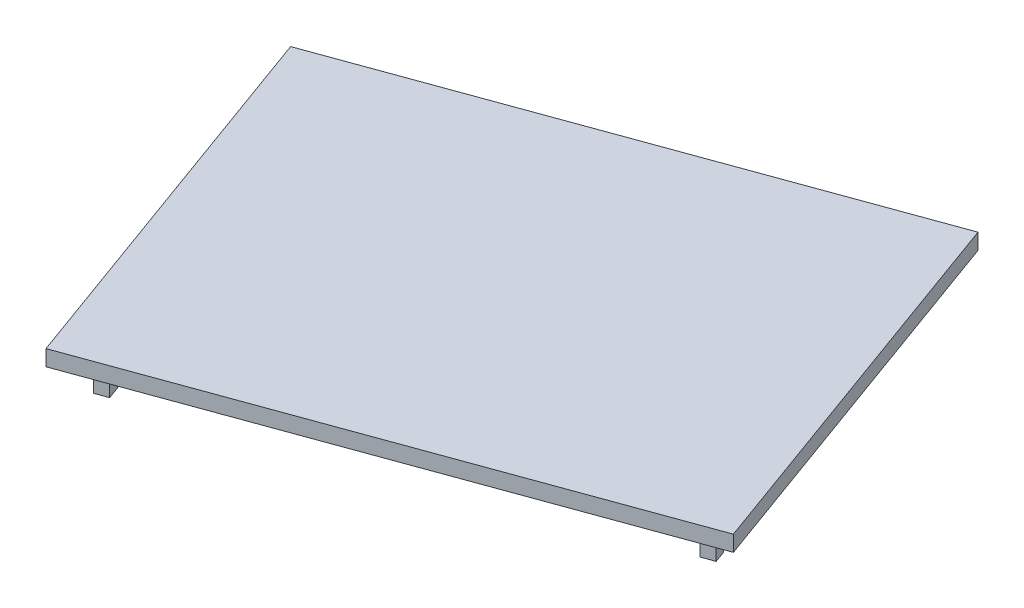
ISO-10303-21;
HEADER;
FILE_DESCRIPTION(('STEP AP214'),'2;1');
FILE_NAME('part.step','',(''),(''),'','','');
FILE_SCHEMA(('AUTOMOTIVE_DESIGN { 1 0 10303 214 1 1 1 1 }'));
ENDSEC;
DATA;
#1=APPLICATION_CONTEXT('core data for automotive mechanical design processes');
#2=APPLICATION_PROTOCOL_DEFINITION('international standard','automotive_design',2000,#1);
#3=PRODUCT_CONTEXT('',#1,'mechanical');
#4=PRODUCT('Part','Part','',(#3));
#5=PRODUCT_RELATED_PRODUCT_CATEGORY('part','',(#4));
#6=PRODUCT_DEFINITION_FORMATION('','',#4);
#7=PRODUCT_DEFINITION_CONTEXT('part definition',#1,'design');
#8=PRODUCT_DEFINITION('design','',#6,#7);
#9=PRODUCT_DEFINITION_SHAPE('','',#8);
#10=(LENGTH_UNIT() NAMED_UNIT(*) SI_UNIT(.MILLI.,.METRE.));
#11=(NAMED_UNIT(*) PLANE_ANGLE_UNIT() SI_UNIT($,.RADIAN.));
#12=(NAMED_UNIT(*) SI_UNIT($,.STERADIAN.) SOLID_ANGLE_UNIT());
#13=UNCERTAINTY_MEASURE_WITH_UNIT(LENGTH_MEASURE(1.E-05),#10,'distance_accuracy_value','');
#14=(GEOMETRIC_REPRESENTATION_CONTEXT(3) GLOBAL_UNCERTAINTY_ASSIGNED_CONTEXT((#13)) GLOBAL_UNIT_ASSIGNED_CONTEXT((#10,
#11,#12)) REPRESENTATION_CONTEXT('',''));
#15=CARTESIAN_POINT('',(0.,0.,0.));
#16=DIRECTION('',(0.,0.,1.));
#17=DIRECTION('',(1.,0.,0.));
#18=AXIS2_PLACEMENT_3D('',#15,#16,#17);
#19=CARTESIAN_POINT('',(-57.849497126795,5.,89.7905495932135));
#20=DIRECTION('',(0.940067335724902,0.,-0.34098886243261));
#21=DIRECTION('',(-0.34098886243261,0.,-0.940067335724902));
#22=AXIS2_PLACEMENT_3D('',#19,#20,#21);
#23=PLANE('',#22);
#24=DIRECTION('',(0.34098886243261,0.,0.940067335724902));
#25=VECTOR('',#24,1.);
#26=CARTESIAN_POINT('',(-57.849497126795,0.,89.7905495932135));
#27=LINE('',#26,#25);
#28=CARTESIAN_POINT('',(-101.961949946439,0.,-31.8224429796701));
#29=VERTEX_POINT('',#28);
#30=CARTESIAN_POINT('',(-57.849497126795,0.,89.7905495932135));
#31=VERTEX_POINT('',#30);
#32=EDGE_CURVE('E298',#29,#31,#27,.T.);
#33=ORIENTED_EDGE('',*,*,#32,.T.);
#34=DIRECTION('',(0.,-1.,0.));
#35=VECTOR('',#34,1.);
#36=CARTESIAN_POINT('',(-57.849497126795,5.,89.7905495932135));
#37=LINE('',#36,#35);
#38=CARTESIAN_POINT('',(-57.849497126795,5.,89.7905495932135));
#39=VERTEX_POINT('',#38);
#40=EDGE_CURVE('E11',#39,#31,#37,.T.);
#41=ORIENTED_EDGE('',*,*,#40,.F.);
#42=DIRECTION('',(0.34098886243261,0.,0.940067335724902));
#43=VECTOR('',#42,1.);
#44=CARTESIAN_POINT('',(-57.849497126795,5.,89.7905495932135));
#45=LINE('',#44,#43);
#46=CARTESIAN_POINT('',(-101.961949946439,5.,-31.8224429796701));
#47=VERTEX_POINT('',#46);
#48=EDGE_CURVE('E307',#47,#39,#45,.T.);
#49=ORIENTED_EDGE('',*,*,#48,.F.);
#50=DIRECTION('',(0.,-1.,0.));
#51=VECTOR('',#50,1.);
#52=CARTESIAN_POINT('',(-101.961949946439,5.,-31.8224429796701));
#53=LINE('',#52,#51);
#54=EDGE_CURVE('E317',#47,#29,#53,.T.);
#55=ORIENTED_EDGE('',*,*,#54,.T.);
#56=EDGE_LOOP('',(#33,#41,#49,#55));
#57=FACE_BOUND('',#56,.T.);
#58=ADVANCED_FACE('F37',(#57),#23,.F.);
#59=CARTESIAN_POINT('',(101.961949946438,5.,31.8224429796698));
#60=DIRECTION('',(-0.34098886243261,0.,-0.940067335724902));
#61=DIRECTION('',(-0.940067335724902,0.,0.34098886243261));
#62=AXIS2_PLACEMENT_3D('',#59,#60,#61);
#63=PLANE('',#62);
#64=DIRECTION('',(0.940067335724902,0.,-0.34098886243261));
#65=VECTOR('',#64,1.);
#66=CARTESIAN_POINT('',(101.961949946438,0.,31.8224429796698));
#67=LINE('',#66,#65);
#68=CARTESIAN_POINT('',(101.961949946438,0.,31.8224429796698));
#69=VERTEX_POINT('',#68);
#70=EDGE_CURVE('E320',#31,#69,#67,.T.);
#71=ORIENTED_EDGE('',*,*,#70,.T.);
#72=DIRECTION('',(0.,-1.,0.));
#73=VECTOR('',#72,1.);
#74=CARTESIAN_POINT('',(101.961949946438,5.,31.8224429796698));
#75=LINE('',#74,#73);
#76=CARTESIAN_POINT('',(101.961949946438,5.,31.8224429796698));
#77=VERTEX_POINT('',#76);
#78=EDGE_CURVE('E44',#77,#69,#75,.T.);
#79=ORIENTED_EDGE('',*,*,#78,.F.);
#80=DIRECTION('',(0.940067335724902,0.,-0.34098886243261));
#81=VECTOR('',#80,1.);
#82=CARTESIAN_POINT('',(101.961949946438,5.,31.8224429796698));
#83=LINE('',#82,#81);
#84=EDGE_CURVE('E310',#39,#77,#83,.T.);
#85=ORIENTED_EDGE('',*,*,#84,.F.);
#86=ORIENTED_EDGE('',*,*,#40,.T.);
#87=EDGE_LOOP('',(#71,#79,#85,#86));
#88=FACE_BOUND('',#87,.T.);
#89=ADVANCED_FACE('F350',(#88),#63,.F.);
#90=CARTESIAN_POINT('',(57.8494971267941,5.,-89.7905495932141));
#91=DIRECTION('',(-0.940067335724901,0.,0.340988862432612));
#92=DIRECTION('',(0.340988862432612,0.,0.940067335724901));
#93=AXIS2_PLACEMENT_3D('',#90,#91,#92);
#94=PLANE('',#93);
#95=DIRECTION('',(-0.340988862432612,0.,-0.940067335724901));
#96=VECTOR('',#95,1.);
#97=CARTESIAN_POINT('',(57.8494971267941,0.,-89.7905495932141));
#98=LINE('',#97,#96);
#99=CARTESIAN_POINT('',(57.8494971267941,0.,-89.7905495932141));
#100=VERTEX_POINT('',#99);
#101=EDGE_CURVE('E322',#69,#100,#98,.T.);
#102=ORIENTED_EDGE('',*,*,#101,.T.);
#103=DIRECTION('',(0.,-1.,0.));
#104=VECTOR('',#103,1.);
#105=CARTESIAN_POINT('',(57.8494971267941,5.,-89.7905495932141));
#106=LINE('',#105,#104);
#107=CARTESIAN_POINT('',(57.8494971267941,5.,-89.7905495932141));
#108=VERTEX_POINT('',#107);
#109=EDGE_CURVE('E327',#108,#100,#106,.T.);
#110=ORIENTED_EDGE('',*,*,#109,.F.);
#111=DIRECTION('',(-0.340988862432612,0.,-0.940067335724901));
#112=VECTOR('',#111,1.);
#113=CARTESIAN_POINT('',(57.8494971267941,5.,-89.7905495932141));
#114=LINE('',#113,#112);
#115=EDGE_CURVE('E313',#77,#108,#114,.T.);
#116=ORIENTED_EDGE('',*,*,#115,.F.);
#117=ORIENTED_EDGE('',*,*,#78,.T.);
#118=EDGE_LOOP('',(#102,#110,#116,#117));
#119=FACE_BOUND('',#118,.T.);
#120=ADVANCED_FACE('F334',(#119),#94,.F.);
#121=CARTESIAN_POINT('',(-101.961949946439,5.,-31.8224429796701));
#122=DIRECTION('',(0.340988862432613,0.,0.9400673357249));
#123=DIRECTION('',(0.940067335724901,0.,-0.340988862432613));
#124=AXIS2_PLACEMENT_3D('',#121,#122,#123);
#125=PLANE('',#124);
#126=DIRECTION('',(-0.940067335724901,0.,0.340988862432613));
#127=VECTOR('',#126,1.);
#128=CARTESIAN_POINT('',(-101.961949946439,0.,-31.8224429796701));
#129=LINE('',#128,#127);
#130=EDGE_CURVE('E311',#100,#29,#129,.T.);
#131=ORIENTED_EDGE('',*,*,#130,.T.);
#132=ORIENTED_EDGE('',*,*,#54,.F.);
#133=DIRECTION('',(-0.940067335724901,0.,0.340988862432613));
#134=VECTOR('',#133,1.);
#135=CARTESIAN_POINT('',(-101.961949946439,5.,-31.8224429796701));
#136=LINE('',#135,#134);
#137=EDGE_CURVE('E315',#108,#47,#136,.T.);
#138=ORIENTED_EDGE('',*,*,#137,.F.);
#139=ORIENTED_EDGE('',*,*,#109,.T.);
#140=EDGE_LOOP('',(#131,#132,#138,#139));
#141=FACE_BOUND('',#140,.T.);
#142=ADVANCED_FACE('F343',(#141),#125,.F.);
#143=CARTESIAN_POINT('',(0.,5.,0.));
#144=DIRECTION('',(0.,-1.,0.));
#145=DIRECTION('',(0.,0.,-1.));
#146=AXIS2_PLACEMENT_3D('',#143,#144,#145);
#147=PLANE('',#146);
#148=ORIENTED_EDGE('',*,*,#48,.T.);
#149=ORIENTED_EDGE('',*,*,#84,.T.);
#150=ORIENTED_EDGE('',*,*,#115,.T.);
#151=ORIENTED_EDGE('',*,*,#137,.T.);
#152=EDGE_LOOP('',(#148,#149,#150,#151));
#153=FACE_BOUND('',#152,.T.);
#154=ADVANCED_FACE('F349',(#153),#147,.F.);
#155=CARTESIAN_POINT('',(0.,0.,0.));
#156=DIRECTION('',(0.,-1.,0.));
#157=DIRECTION('',(0.,0.,-1.));
#158=AXIS2_PLACEMENT_3D('',#155,#156,#157);
#159=PLANE('',#158);
#160=DIRECTION('',(0.34098886243261,0.,0.940067335724901));
#161=VECTOR('',#160,1.);
#162=CARTESIAN_POINT('',(-90.3495449114483,0.,-23.2695458504328));
#163=LINE('',#162,#161);
#164=CARTESIAN_POINT('',(-91.7296475670492,0.,-27.0743311950977));
#165=VERTEX_POINT('',#164);
#166=CARTESIAN_POINT('',(-90.3495449114483,0.,-23.2695458504328));
#167=VERTEX_POINT('',#166);
#168=EDGE_CURVE('E202',#165,#167,#163,.T.);
#169=ORIENTED_EDGE('',*,*,#168,.T.);
#170=DIRECTION('',(0.940067335724902,0.,-0.34098886243261));
#171=VECTOR('',#170,1.);
#172=CARTESIAN_POINT('',(-90.3495449114483,0.,-23.2695458504328));
#173=LINE('',#172,#171);
#174=CARTESIAN_POINT('',(-86.5892755685487,0.,-24.6335013001632));
#175=VERTEX_POINT('',#174);
#176=EDGE_CURVE('E178',#167,#175,#173,.T.);
#177=ORIENTED_EDGE('',*,*,#176,.T.);
#178=DIRECTION('',(-0.34098886243261,0.,-0.940067335724901));
#179=VECTOR('',#178,1.);
#180=CARTESIAN_POINT('',(-86.5892755685487,0.,-24.6335013001632));
#181=LINE('',#180,#179);
#182=CARTESIAN_POINT('',(-87.9693782241496,0.,-28.4382866448282));
#183=VERTEX_POINT('',#182);
#184=EDGE_CURVE('E56',#175,#183,#181,.T.);
#185=ORIENTED_EDGE('',*,*,#184,.T.);
#186=DIRECTION('',(-0.940067335724902,0.,0.34098886243261));
#187=VECTOR('',#186,1.);
#188=CARTESIAN_POINT('',(-91.7296475670492,0.,-27.0743311950977));
#189=LINE('',#188,#187);
#190=EDGE_CURVE('E51',#183,#165,#189,.T.);
#191=ORIENTED_EDGE('',*,*,#190,.T.);
#192=EDGE_LOOP('',(#169,#177,#185,#191));
#193=FACE_BOUND('',#192,.T.);
#194=DIRECTION('',(0.340988862432608,0.,0.940067335724902));
#195=VECTOR('',#194,1.);
#196=CARTESIAN_POINT('',(50.6605554472868,0.,-74.4178752153243));
#197=LINE('',#196,#195);
#198=CARTESIAN_POINT('',(49.2977831440545,0.,-78.1748827585032));
#199=VERTEX_POINT('',#198);
#200=CARTESIAN_POINT('',(50.6605554472868,0.,-74.4178752153243));
#201=VERTEX_POINT('',#200);
#202=EDGE_CURVE('E207',#199,#201,#197,.T.);
#203=ORIENTED_EDGE('',*,*,#202,.T.);
#204=DIRECTION('',(0.940067335724902,0.,-0.340988862432607));
#205=VECTOR('',#204,1.);
#206=CARTESIAN_POINT('',(50.6605554472868,0.,-74.4178752153243));
#207=LINE('',#206,#205);
#208=CARTESIAN_POINT('',(54.4208247901864,0.,-75.7818306650548));
#209=VERTEX_POINT('',#208);
#210=EDGE_CURVE('E226',#201,#209,#207,.T.);
#211=ORIENTED_EDGE('',*,*,#210,.T.);
#212=DIRECTION('',(-0.340988862432607,0.,-0.940067335724903));
#213=VECTOR('',#212,1.);
#214=CARTESIAN_POINT('',(54.4208247901864,0.,-75.7818306650548));
#215=LINE('',#214,#213);
#216=CARTESIAN_POINT('',(53.0580524869541,0.,-79.5388382082336));
#217=VERTEX_POINT('',#216);
#218=EDGE_CURVE('E228',#209,#217,#215,.T.);
#219=ORIENTED_EDGE('',*,*,#218,.T.);
#220=DIRECTION('',(-0.940067335724903,0.,0.340988862432607));
#221=VECTOR('',#220,1.);
#222=CARTESIAN_POINT('',(49.2977831440545,0.,-78.1748827585032));
#223=LINE('',#222,#221);
#224=EDGE_CURVE('E215',#217,#199,#223,.T.);
#225=ORIENTED_EDGE('',*,*,#224,.T.);
#226=EDGE_LOOP('',(#203,#211,#219,#225));
#227=FACE_BOUND('',#226,.T.);
#228=DIRECTION('',(0.340988862432605,0.,0.940067335724903));
#229=VECTOR('',#228,1.);
#230=CARTESIAN_POINT('',(87.9532310182788,0.,28.3937706430619));
#231=LINE('',#230,#229);
#232=CARTESIAN_POINT('',(86.6045248639509,0.,24.675541865354));
#233=VERTEX_POINT('',#232);
#234=CARTESIAN_POINT('',(87.9532310182788,0.,28.3937706430619));
#235=VERTEX_POINT('',#234);
#236=EDGE_CURVE('E234',#233,#235,#231,.T.);
#237=ORIENTED_EDGE('',*,*,#236,.T.);
#238=DIRECTION('',(0.940067335724903,0.,-0.340988862432606));
#239=VECTOR('',#238,1.);
#240=CARTESIAN_POINT('',(87.9532310182788,0.,28.3937706430619));
#241=LINE('',#240,#239);
#242=CARTESIAN_POINT('',(91.7135003611785,0.,27.0298151933315));
#243=VERTEX_POINT('',#242);
#244=EDGE_CURVE('E258',#235,#243,#241,.T.);
#245=ORIENTED_EDGE('',*,*,#244,.T.);
#246=DIRECTION('',(-0.340988862432605,0.,-0.940067335724903));
#247=VECTOR('',#246,1.);
#248=CARTESIAN_POINT('',(91.7135003611785,0.,27.0298151933315));
#249=LINE('',#248,#247);
#250=CARTESIAN_POINT('',(90.3647942068506,0.,23.3115864156235));
#251=VERTEX_POINT('',#250);
#252=EDGE_CURVE('E260',#243,#251,#249,.T.);
#253=ORIENTED_EDGE('',*,*,#252,.T.);
#254=DIRECTION('',(-0.940067335724903,0.,0.340988862432606));
#255=VECTOR('',#254,1.);
#256=CARTESIAN_POINT('',(86.6045248639509,0.,24.675541865354));
#257=LINE('',#256,#255);
#258=EDGE_CURVE('E247',#251,#233,#257,.T.);
#259=ORIENTED_EDGE('',*,*,#258,.T.);
#260=EDGE_LOOP('',(#237,#245,#253,#259));
#261=FACE_BOUND('',#260,.T.);
#262=DIRECTION('',(0.340988862432606,0.,0.940067335724903));
#263=VECTOR('',#262,1.);
#264=CARTESIAN_POINT('',(-53.056842774629,0.,79.5420852510544));
#265=LINE('',#264,#263);
#266=CARTESIAN_POINT('',(-54.521252401854,0.,75.504875217699));
#267=VERTEX_POINT('',#266);
#268=CARTESIAN_POINT('',(-53.056842774629,0.,79.5420852510544));
#269=VERTEX_POINT('',#268);
#270=EDGE_CURVE('E266',#267,#269,#265,.T.);
#271=ORIENTED_EDGE('',*,*,#270,.T.);
#272=DIRECTION('',(0.940067335724903,0.,-0.340988862432606));
#273=VECTOR('',#272,1.);
#274=CARTESIAN_POINT('',(-53.056842774629,0.,79.5420852510544));
#275=LINE('',#274,#273);
#276=CARTESIAN_POINT('',(-49.2965734317293,0.,78.178129801324));
#277=VERTEX_POINT('',#276);
#278=EDGE_CURVE('E290',#269,#277,#275,.T.);
#279=ORIENTED_EDGE('',*,*,#278,.T.);
#280=DIRECTION('',(-0.340988862432606,0.,-0.940067335724903));
#281=VECTOR('',#280,1.);
#282=CARTESIAN_POINT('',(-49.2965734317294,0.,78.178129801324));
#283=LINE('',#282,#281);
#284=CARTESIAN_POINT('',(-50.7609830589544,0.,74.1409197679686));
#285=VERTEX_POINT('',#284);
#286=EDGE_CURVE('E292',#277,#285,#283,.T.);
#287=ORIENTED_EDGE('',*,*,#286,.T.);
#288=DIRECTION('',(-0.940067335724903,0.,0.340988862432606));
#289=VECTOR('',#288,1.);
#290=CARTESIAN_POINT('',(-54.521252401854,0.,75.504875217699));
#291=LINE('',#290,#289);
#292=EDGE_CURVE('E279',#285,#267,#291,.T.);
#293=ORIENTED_EDGE('',*,*,#292,.T.);
#294=EDGE_LOOP('',(#271,#279,#287,#293));
#295=FACE_BOUND('',#294,.T.);
#296=ORIENTED_EDGE('',*,*,#32,.F.);
#297=ORIENTED_EDGE('',*,*,#130,.F.);
#298=ORIENTED_EDGE('',*,*,#101,.F.);
#299=ORIENTED_EDGE('',*,*,#70,.F.);
#300=EDGE_LOOP('',(#296,#297,#298,#299));
#301=FACE_BOUND('',#300,.T.);
#302=ADVANCED_FACE('F340',(#193,#227,#261,#295,#301),#159,.T.);
#303=CARTESIAN_POINT('',(-53.056842774629,-10.,79.5420852510544));
#304=DIRECTION('',(-0.940067335724903,0.,0.340988862432606));
#305=DIRECTION('',(0.340988862432606,0.,0.940067335724903));
#306=AXIS2_PLACEMENT_3D('',#303,#304,#305);
#307=PLANE('',#306);
#308=ORIENTED_EDGE('',*,*,#270,.F.);
#309=DIRECTION('',(0.,1.,0.));
#310=VECTOR('',#309,1.);
#311=CARTESIAN_POINT('',(-54.521252401854,-10.,75.504875217699));
#312=LINE('',#311,#310);
#313=CARTESIAN_POINT('',(-54.521252401854,-10.,75.504875217699));
#314=VERTEX_POINT('',#313);
#315=EDGE_CURVE('E295',#314,#267,#312,.T.);
#316=ORIENTED_EDGE('',*,*,#315,.F.);
#317=DIRECTION('',(0.340988862432606,0.,0.940067335724903));
#318=VECTOR('',#317,1.);
#319=CARTESIAN_POINT('',(-53.056842774629,-10.,79.5420852510544));
#320=LINE('',#319,#318);
#321=CARTESIAN_POINT('',(-53.056842774629,-10.,79.5420852510544));
#322=VERTEX_POINT('',#321);
#323=EDGE_CURVE('E275',#314,#322,#320,.T.);
#324=ORIENTED_EDGE('',*,*,#323,.T.);
#325=DIRECTION('',(0.,1.,0.));
#326=VECTOR('',#325,1.);
#327=CARTESIAN_POINT('',(-53.056842774629,-10.,79.5420852510544));
#328=LINE('',#327,#326);
#329=EDGE_CURVE('E288',#322,#269,#328,.T.);
#330=ORIENTED_EDGE('',*,*,#329,.T.);
#331=EDGE_LOOP('',(#308,#316,#324,#330));
#332=FACE_BOUND('',#331,.T.);
#333=ADVANCED_FACE('F362',(#332),#307,.T.);
#334=CARTESIAN_POINT('',(-54.521252401854,-10.,75.504875217699));
#335=DIRECTION('',(-0.340988862432606,0.,-0.940067335724903));
#336=DIRECTION('',(-0.940067335724903,0.,0.340988862432606));
#337=AXIS2_PLACEMENT_3D('',#334,#335,#336);
#338=PLANE('',#337);
#339=ORIENTED_EDGE('',*,*,#292,.F.);
#340=DIRECTION('',(0.,1.,0.));
#341=VECTOR('',#340,1.);
#342=CARTESIAN_POINT('',(-50.7609830589544,-10.,74.1409197679686));
#343=LINE('',#342,#341);
#344=CARTESIAN_POINT('',(-50.7609830589544,-10.,74.1409197679686));
#345=VERTEX_POINT('',#344);
#346=EDGE_CURVE('E299',#345,#285,#343,.T.);
#347=ORIENTED_EDGE('',*,*,#346,.F.);
#348=DIRECTION('',(-0.940067335724903,0.,0.340988862432606));
#349=VECTOR('',#348,1.);
#350=CARTESIAN_POINT('',(-54.521252401854,-10.,75.504875217699));
#351=LINE('',#350,#349);
#352=EDGE_CURVE('E285',#345,#314,#351,.T.);
#353=ORIENTED_EDGE('',*,*,#352,.T.);
#354=ORIENTED_EDGE('',*,*,#315,.T.);
#355=EDGE_LOOP('',(#339,#347,#353,#354));
#356=FACE_BOUND('',#355,.T.);
#357=ADVANCED_FACE('F367',(#356),#338,.T.);
#358=CARTESIAN_POINT('',(-49.2965734317294,-10.,78.178129801324));
#359=DIRECTION('',(0.940067335724903,0.,-0.340988862432606));
#360=DIRECTION('',(-0.340988862432606,0.,-0.940067335724903));
#361=AXIS2_PLACEMENT_3D('',#358,#359,#360);
#362=PLANE('',#361);
#363=ORIENTED_EDGE('',*,*,#286,.F.);
#364=DIRECTION('',(0.,1.,0.));
#365=VECTOR('',#364,1.);
#366=CARTESIAN_POINT('',(-49.2965734317294,-10.,78.178129801324));
#367=LINE('',#366,#365);
#368=CARTESIAN_POINT('',(-49.2965734317294,-10.,78.178129801324));
#369=VERTEX_POINT('',#368);
#370=EDGE_CURVE('E302',#369,#277,#367,.T.);
#371=ORIENTED_EDGE('',*,*,#370,.F.);
#372=DIRECTION('',(-0.340988862432606,0.,-0.940067335724903));
#373=VECTOR('',#372,1.);
#374=CARTESIAN_POINT('',(-49.2965734317294,-10.,78.178129801324));
#375=LINE('',#374,#373);
#376=EDGE_CURVE('E282',#369,#345,#375,.T.);
#377=ORIENTED_EDGE('',*,*,#376,.T.);
#378=ORIENTED_EDGE('',*,*,#346,.T.);
#379=EDGE_LOOP('',(#363,#371,#377,#378));
#380=FACE_BOUND('',#379,.T.);
#381=ADVANCED_FACE('F373',(#380),#362,.T.);
#382=CARTESIAN_POINT('',(-53.056842774629,-10.,79.5420852510544));
#383=DIRECTION('',(0.340988862432606,0.,0.940067335724903));
#384=DIRECTION('',(0.940067335724903,0.,-0.340988862432606));
#385=AXIS2_PLACEMENT_3D('',#382,#383,#384);
#386=PLANE('',#385);
#387=ORIENTED_EDGE('',*,*,#278,.F.);
#388=ORIENTED_EDGE('',*,*,#329,.F.);
#389=DIRECTION('',(0.940067335724903,0.,-0.340988862432606));
#390=VECTOR('',#389,1.);
#391=CARTESIAN_POINT('',(-53.056842774629,-10.,79.5420852510544));
#392=LINE('',#391,#390);
#393=EDGE_CURVE('E278',#322,#369,#392,.T.);
#394=ORIENTED_EDGE('',*,*,#393,.T.);
#395=ORIENTED_EDGE('',*,*,#370,.T.);
#396=EDGE_LOOP('',(#387,#388,#394,#395));
#397=FACE_BOUND('',#396,.T.);
#398=ADVANCED_FACE('F369',(#397),#386,.T.);
#399=CARTESIAN_POINT('',(0.,-10.,0.));
#400=DIRECTION('',(0.,-1.,0.));
#401=DIRECTION('',(0.,0.,-1.));
#402=AXIS2_PLACEMENT_3D('',#399,#400,#401);
#403=PLANE('',#402);
#404=ORIENTED_EDGE('',*,*,#323,.F.);
#405=ORIENTED_EDGE('',*,*,#352,.F.);
#406=ORIENTED_EDGE('',*,*,#376,.F.);
#407=ORIENTED_EDGE('',*,*,#393,.F.);
#408=EDGE_LOOP('',(#404,#405,#406,#407));
#409=FACE_BOUND('',#408,.T.);
#410=ADVANCED_FACE('F372',(#409),#403,.T.);
#411=CARTESIAN_POINT('',(87.9532310182788,-10.,28.3937706430619));
#412=DIRECTION('',(-0.940067335724903,0.,0.340988862432605));
#413=DIRECTION('',(0.340988862432605,0.,0.940067335724903));
#414=AXIS2_PLACEMENT_3D('',#411,#412,#413);
#415=PLANE('',#414);
#416=ORIENTED_EDGE('',*,*,#236,.F.);
#417=DIRECTION('',(0.,1.,0.));
#418=VECTOR('',#417,1.);
#419=CARTESIAN_POINT('',(86.6045248639509,-10.,24.675541865354));
#420=LINE('',#419,#418);
#421=CARTESIAN_POINT('',(86.6045248639509,-10.,24.675541865354));
#422=VERTEX_POINT('',#421);
#423=EDGE_CURVE('E263',#422,#233,#420,.T.);
#424=ORIENTED_EDGE('',*,*,#423,.F.);
#425=DIRECTION('',(0.340988862432605,0.,0.940067335724903));
#426=VECTOR('',#425,1.);
#427=CARTESIAN_POINT('',(87.9532310182788,-10.,28.3937706430619));
#428=LINE('',#427,#426);
#429=CARTESIAN_POINT('',(87.9532310182788,-10.,28.3937706430619));
#430=VERTEX_POINT('',#429);
#431=EDGE_CURVE('E243',#422,#430,#428,.T.);
#432=ORIENTED_EDGE('',*,*,#431,.T.);
#433=DIRECTION('',(0.,1.,0.));
#434=VECTOR('',#433,1.);
#435=CARTESIAN_POINT('',(87.9532310182788,-10.,28.3937706430619));
#436=LINE('',#435,#434);
#437=EDGE_CURVE('E256',#430,#235,#436,.T.);
#438=ORIENTED_EDGE('',*,*,#437,.T.);
#439=EDGE_LOOP('',(#416,#424,#432,#438));
#440=FACE_BOUND('',#439,.T.);
#441=ADVANCED_FACE('F383',(#440),#415,.T.);
#442=CARTESIAN_POINT('',(86.6045248639509,-10.,24.675541865354));
#443=DIRECTION('',(-0.340988862432606,0.,-0.940067335724903));
#444=DIRECTION('',(-0.940067335724903,0.,0.340988862432606));
#445=AXIS2_PLACEMENT_3D('',#442,#443,#444);
#446=PLANE('',#445);
#447=ORIENTED_EDGE('',*,*,#258,.F.);
#448=DIRECTION('',(0.,1.,0.));
#449=VECTOR('',#448,1.);
#450=CARTESIAN_POINT('',(90.3647942068506,-10.,23.3115864156235));
#451=LINE('',#450,#449);
#452=CARTESIAN_POINT('',(90.3647942068506,-10.,23.3115864156235));
#453=VERTEX_POINT('',#452);
#454=EDGE_CURVE('E267',#453,#251,#451,.T.);
#455=ORIENTED_EDGE('',*,*,#454,.F.);
#456=DIRECTION('',(-0.940067335724903,0.,0.340988862432606));
#457=VECTOR('',#456,1.);
#458=CARTESIAN_POINT('',(86.6045248639509,-10.,24.675541865354));
#459=LINE('',#458,#457);
#460=EDGE_CURVE('E253',#453,#422,#459,.T.);
#461=ORIENTED_EDGE('',*,*,#460,.T.);
#462=ORIENTED_EDGE('',*,*,#423,.T.);
#463=EDGE_LOOP('',(#447,#455,#461,#462));
#464=FACE_BOUND('',#463,.T.);
#465=ADVANCED_FACE('F387',(#464),#446,.T.);
#466=CARTESIAN_POINT('',(91.7135003611785,-10.,27.0298151933315));
#467=DIRECTION('',(0.940067335724903,0.,-0.340988862432605));
#468=DIRECTION('',(-0.340988862432605,0.,-0.940067335724903));
#469=AXIS2_PLACEMENT_3D('',#466,#467,#468);
#470=PLANE('',#469);
#471=ORIENTED_EDGE('',*,*,#252,.F.);
#472=DIRECTION('',(0.,1.,0.));
#473=VECTOR('',#472,1.);
#474=CARTESIAN_POINT('',(91.7135003611785,-10.,27.0298151933315));
#475=LINE('',#474,#473);
#476=CARTESIAN_POINT('',(91.7135003611785,-10.,27.0298151933315));
#477=VERTEX_POINT('',#476);
#478=EDGE_CURVE('E270',#477,#243,#475,.T.);
#479=ORIENTED_EDGE('',*,*,#478,.F.);
#480=DIRECTION('',(-0.340988862432605,0.,-0.940067335724903));
#481=VECTOR('',#480,1.);
#482=CARTESIAN_POINT('',(91.7135003611785,-10.,27.0298151933315));
#483=LINE('',#482,#481);
#484=EDGE_CURVE('E250',#477,#453,#483,.T.);
#485=ORIENTED_EDGE('',*,*,#484,.T.);
#486=ORIENTED_EDGE('',*,*,#454,.T.);
#487=EDGE_LOOP('',(#471,#479,#485,#486));
#488=FACE_BOUND('',#487,.T.);
#489=ADVANCED_FACE('F393',(#488),#470,.T.);
#490=CARTESIAN_POINT('',(87.9532310182788,-10.,28.3937706430619));
#491=DIRECTION('',(0.340988862432606,0.,0.940067335724903));
#492=DIRECTION('',(0.940067335724903,0.,-0.340988862432606));
#493=AXIS2_PLACEMENT_3D('',#490,#491,#492);
#494=PLANE('',#493);
#495=ORIENTED_EDGE('',*,*,#244,.F.);
#496=ORIENTED_EDGE('',*,*,#437,.F.);
#497=DIRECTION('',(0.940067335724903,0.,-0.340988862432606));
#498=VECTOR('',#497,1.);
#499=CARTESIAN_POINT('',(87.9532310182788,-10.,28.3937706430619));
#500=LINE('',#499,#498);
#501=EDGE_CURVE('E246',#430,#477,#500,.T.);
#502=ORIENTED_EDGE('',*,*,#501,.T.);
#503=ORIENTED_EDGE('',*,*,#478,.T.);
#504=EDGE_LOOP('',(#495,#496,#502,#503));
#505=FACE_BOUND('',#504,.T.);
#506=ADVANCED_FACE('F389',(#505),#494,.T.);
#507=CARTESIAN_POINT('',(0.,-10.,0.));
#508=DIRECTION('',(0.,-1.,0.));
#509=DIRECTION('',(0.,0.,-1.));
#510=AXIS2_PLACEMENT_3D('',#507,#508,#509);
#511=PLANE('',#510);
#512=ORIENTED_EDGE('',*,*,#431,.F.);
#513=ORIENTED_EDGE('',*,*,#460,.F.);
#514=ORIENTED_EDGE('',*,*,#484,.F.);
#515=ORIENTED_EDGE('',*,*,#501,.F.);
#516=EDGE_LOOP('',(#512,#513,#514,#515));
#517=FACE_BOUND('',#516,.T.);
#518=ADVANCED_FACE('F392',(#517),#511,.T.);
#519=CARTESIAN_POINT('',(50.6605554472868,-10.,-74.4178752153243));
#520=DIRECTION('',(-0.940067335724902,0.,0.340988862432608));
#521=DIRECTION('',(0.340988862432608,0.,0.940067335724902));
#522=AXIS2_PLACEMENT_3D('',#519,#520,#521);
#523=PLANE('',#522);
#524=ORIENTED_EDGE('',*,*,#202,.F.);
#525=DIRECTION('',(0.,1.,0.));
#526=VECTOR('',#525,1.);
#527=CARTESIAN_POINT('',(49.2977831440545,-10.,-78.1748827585032));
#528=LINE('',#527,#526);
#529=CARTESIAN_POINT('',(49.2977831440545,-10.,-78.1748827585032));
#530=VERTEX_POINT('',#529);
#531=EDGE_CURVE('E231',#530,#199,#528,.T.);
#532=ORIENTED_EDGE('',*,*,#531,.F.);
#533=DIRECTION('',(0.340988862432608,0.,0.940067335724902));
#534=VECTOR('',#533,1.);
#535=CARTESIAN_POINT('',(50.6605554472868,-10.,-74.4178752153243));
#536=LINE('',#535,#534);
#537=CARTESIAN_POINT('',(50.6605554472868,-10.,-74.4178752153243));
#538=VERTEX_POINT('',#537);
#539=EDGE_CURVE('E211',#530,#538,#536,.T.);
#540=ORIENTED_EDGE('',*,*,#539,.T.);
#541=DIRECTION('',(0.,1.,0.));
#542=VECTOR('',#541,1.);
#543=CARTESIAN_POINT('',(50.6605554472868,-10.,-74.4178752153243));
#544=LINE('',#543,#542);
#545=EDGE_CURVE('E224',#538,#201,#544,.T.);
#546=ORIENTED_EDGE('',*,*,#545,.T.);
#547=EDGE_LOOP('',(#524,#532,#540,#546));
#548=FACE_BOUND('',#547,.T.);
#549=ADVANCED_FACE('F403',(#548),#523,.T.);
#550=CARTESIAN_POINT('',(49.2977831440545,-10.,-78.1748827585032));
#551=DIRECTION('',(-0.340988862432607,0.,-0.940067335724903));
#552=DIRECTION('',(-0.940067335724903,0.,0.340988862432607));
#553=AXIS2_PLACEMENT_3D('',#550,#551,#552);
#554=PLANE('',#553);
#555=ORIENTED_EDGE('',*,*,#224,.F.);
#556=DIRECTION('',(0.,1.,0.));
#557=VECTOR('',#556,1.);
#558=CARTESIAN_POINT('',(53.0580524869541,-10.,-79.5388382082336));
#559=LINE('',#558,#557);
#560=CARTESIAN_POINT('',(53.0580524869541,-10.,-79.5388382082336));
#561=VERTEX_POINT('',#560);
#562=EDGE_CURVE('E235',#561,#217,#559,.T.);
#563=ORIENTED_EDGE('',*,*,#562,.F.);
#564=DIRECTION('',(-0.940067335724903,0.,0.340988862432607));
#565=VECTOR('',#564,1.);
#566=CARTESIAN_POINT('',(49.2977831440545,-10.,-78.1748827585032));
#567=LINE('',#566,#565);
#568=EDGE_CURVE('E221',#561,#530,#567,.T.);
#569=ORIENTED_EDGE('',*,*,#568,.T.);
#570=ORIENTED_EDGE('',*,*,#531,.T.);
#571=EDGE_LOOP('',(#555,#563,#569,#570));
#572=FACE_BOUND('',#571,.T.);
#573=ADVANCED_FACE('F407',(#572),#554,.T.);
#574=CARTESIAN_POINT('',(54.4208247901864,-10.,-75.7818306650548));
#575=DIRECTION('',(0.940067335724903,0.,-0.340988862432607));
#576=DIRECTION('',(-0.340988862432607,0.,-0.940067335724903));
#577=AXIS2_PLACEMENT_3D('',#574,#575,#576);
#578=PLANE('',#577);
#579=ORIENTED_EDGE('',*,*,#218,.F.);
#580=DIRECTION('',(0.,1.,0.));
#581=VECTOR('',#580,1.);
#582=CARTESIAN_POINT('',(54.4208247901864,-10.,-75.7818306650548));
#583=LINE('',#582,#581);
#584=CARTESIAN_POINT('',(54.4208247901864,-10.,-75.7818306650548));
#585=VERTEX_POINT('',#584);
#586=EDGE_CURVE('E238',#585,#209,#583,.T.);
#587=ORIENTED_EDGE('',*,*,#586,.F.);
#588=DIRECTION('',(-0.340988862432607,0.,-0.940067335724903));
#589=VECTOR('',#588,1.);
#590=CARTESIAN_POINT('',(54.4208247901864,-10.,-75.7818306650548));
#591=LINE('',#590,#589);
#592=EDGE_CURVE('E218',#585,#561,#591,.T.);
#593=ORIENTED_EDGE('',*,*,#592,.T.);
#594=ORIENTED_EDGE('',*,*,#562,.T.);
#595=EDGE_LOOP('',(#579,#587,#593,#594));
#596=FACE_BOUND('',#595,.T.);
#597=ADVANCED_FACE('F413',(#596),#578,.T.);
#598=CARTESIAN_POINT('',(50.6605554472868,-10.,-74.4178752153243));
#599=DIRECTION('',(0.340988862432607,0.,0.940067335724903));
#600=DIRECTION('',(0.940067335724903,0.,-0.340988862432607));
#601=AXIS2_PLACEMENT_3D('',#598,#599,#600);
#602=PLANE('',#601);
#603=ORIENTED_EDGE('',*,*,#210,.F.);
#604=ORIENTED_EDGE('',*,*,#545,.F.);
#605=DIRECTION('',(0.940067335724902,0.,-0.340988862432607));
#606=VECTOR('',#605,1.);
#607=CARTESIAN_POINT('',(50.6605554472868,-10.,-74.4178752153243));
#608=LINE('',#607,#606);
#609=EDGE_CURVE('E214',#538,#585,#608,.T.);
#610=ORIENTED_EDGE('',*,*,#609,.T.);
#611=ORIENTED_EDGE('',*,*,#586,.T.);
#612=EDGE_LOOP('',(#603,#604,#610,#611));
#613=FACE_BOUND('',#612,.T.);
#614=ADVANCED_FACE('F409',(#613),#602,.T.);
#615=CARTESIAN_POINT('',(0.,-10.,0.));
#616=DIRECTION('',(0.,-1.,0.));
#617=DIRECTION('',(0.,0.,-1.));
#618=AXIS2_PLACEMENT_3D('',#615,#616,#617);
#619=PLANE('',#618);
#620=ORIENTED_EDGE('',*,*,#539,.F.);
#621=ORIENTED_EDGE('',*,*,#568,.F.);
#622=ORIENTED_EDGE('',*,*,#592,.F.);
#623=ORIENTED_EDGE('',*,*,#609,.F.);
#624=EDGE_LOOP('',(#620,#621,#622,#623));
#625=FACE_BOUND('',#624,.T.);
#626=ADVANCED_FACE('F412',(#625),#619,.T.);
#627=CARTESIAN_POINT('',(-90.3495449114483,-10.,-23.2695458504328));
#628=DIRECTION('',(-0.940067335724902,0.,0.34098886243261));
#629=DIRECTION('',(0.34098886243261,0.,0.940067335724902));
#630=AXIS2_PLACEMENT_3D('',#627,#628,#629);
#631=PLANE('',#630);
#632=ORIENTED_EDGE('',*,*,#168,.F.);
#633=DIRECTION('',(0.,1.,0.));
#634=VECTOR('',#633,1.);
#635=CARTESIAN_POINT('',(-91.7296475670492,-10.,-27.0743311950977));
#636=LINE('',#635,#634);
#637=CARTESIAN_POINT('',(-91.7296475670492,-10.,-27.0743311950977));
#638=VERTEX_POINT('',#637);
#639=EDGE_CURVE('E196',#638,#165,#636,.T.);
#640=ORIENTED_EDGE('',*,*,#639,.F.);
#641=DIRECTION('',(0.34098886243261,0.,0.940067335724901));
#642=VECTOR('',#641,1.);
#643=CARTESIAN_POINT('',(-90.3495449114483,-10.,-23.2695458504328));
#644=LINE('',#643,#642);
#645=CARTESIAN_POINT('',(-90.3495449114483,-10.,-23.2695458504328));
#646=VERTEX_POINT('',#645);
#647=EDGE_CURVE('E190',#638,#646,#644,.T.);
#648=ORIENTED_EDGE('',*,*,#647,.T.);
#649=DIRECTION('',(0.,1.,0.));
#650=VECTOR('',#649,1.);
#651=CARTESIAN_POINT('',(-90.3495449114483,-10.,-23.2695458504328));
#652=LINE('',#651,#650);
#653=EDGE_CURVE('E173',#646,#167,#652,.T.);
#654=ORIENTED_EDGE('',*,*,#653,.T.);
#655=EDGE_LOOP('',(#632,#640,#648,#654));
#656=FACE_BOUND('',#655,.T.);
#657=ADVANCED_FACE('F195',(#656),#631,.T.);
#658=CARTESIAN_POINT('',(-91.7296475670492,-10.,-27.0743311950977));
#659=DIRECTION('',(-0.34098886243261,0.,-0.940067335724902));
#660=DIRECTION('',(-0.940067335724902,0.,0.34098886243261));
#661=AXIS2_PLACEMENT_3D('',#658,#659,#660);
#662=PLANE('',#661);
#663=ORIENTED_EDGE('',*,*,#190,.F.);
#664=DIRECTION('',(0.,1.,0.));
#665=VECTOR('',#664,1.);
#666=CARTESIAN_POINT('',(-87.9693782241495,-10.,-28.4382866448282));
#667=LINE('',#666,#665);
#668=CARTESIAN_POINT('',(-87.9693782241495,-10.,-28.4382866448282));
#669=VERTEX_POINT('',#668);
#670=EDGE_CURVE('E208',#669,#183,#667,.T.);
#671=ORIENTED_EDGE('',*,*,#670,.F.);
#672=DIRECTION('',(-0.940067335724902,0.,0.34098886243261));
#673=VECTOR('',#672,1.);
#674=CARTESIAN_POINT('',(-91.7296475670492,-10.,-27.0743311950977));
#675=LINE('',#674,#673);
#676=EDGE_CURVE('E183',#669,#638,#675,.T.);
#677=ORIENTED_EDGE('',*,*,#676,.T.);
#678=ORIENTED_EDGE('',*,*,#639,.T.);
#679=EDGE_LOOP('',(#663,#671,#677,#678));
#680=FACE_BOUND('',#679,.T.);
#681=ADVANCED_FACE('F426',(#680),#662,.T.);
#682=CARTESIAN_POINT('',(-86.5892755685487,-10.,-24.6335013001632));
#683=DIRECTION('',(0.940067335724902,0.,-0.34098886243261));
#684=DIRECTION('',(-0.34098886243261,0.,-0.940067335724902));
#685=AXIS2_PLACEMENT_3D('',#682,#683,#684);
#686=PLANE('',#685);
#687=ORIENTED_EDGE('',*,*,#184,.F.);
#688=DIRECTION('',(0.,1.,0.));
#689=VECTOR('',#688,1.);
#690=CARTESIAN_POINT('',(-86.5892755685487,-10.,-24.6335013001632));
#691=LINE('',#690,#689);
#692=CARTESIAN_POINT('',(-86.5892755685487,-10.,-24.6335013001632));
#693=VERTEX_POINT('',#692);
#694=EDGE_CURVE('E182',#693,#175,#691,.T.);
#695=ORIENTED_EDGE('',*,*,#694,.F.);
#696=DIRECTION('',(-0.34098886243261,0.,-0.940067335724901));
#697=VECTOR('',#696,1.);
#698=CARTESIAN_POINT('',(-86.5892755685487,-10.,-24.6335013001632));
#699=LINE('',#698,#697);
#700=EDGE_CURVE('E193',#693,#669,#699,.T.);
#701=ORIENTED_EDGE('',*,*,#700,.T.);
#702=ORIENTED_EDGE('',*,*,#670,.T.);
#703=EDGE_LOOP('',(#687,#695,#701,#702));
#704=FACE_BOUND('',#703,.T.);
#705=ADVANCED_FACE('F429',(#704),#686,.T.);
#706=CARTESIAN_POINT('',(-90.3495449114483,-10.,-23.2695458504328));
#707=DIRECTION('',(0.34098886243261,0.,0.940067335724902));
#708=DIRECTION('',(0.940067335724902,0.,-0.34098886243261));
#709=AXIS2_PLACEMENT_3D('',#706,#707,#708);
#710=PLANE('',#709);
#711=ORIENTED_EDGE('',*,*,#176,.F.);
#712=ORIENTED_EDGE('',*,*,#653,.F.);
#713=DIRECTION('',(0.940067335724902,0.,-0.34098886243261));
#714=VECTOR('',#713,1.);
#715=CARTESIAN_POINT('',(-90.3495449114483,-10.,-23.2695458504328));
#716=LINE('',#715,#714);
#717=EDGE_CURVE('E177',#646,#693,#716,.T.);
#718=ORIENTED_EDGE('',*,*,#717,.T.);
#719=ORIENTED_EDGE('',*,*,#694,.T.);
#720=EDGE_LOOP('',(#711,#712,#718,#719));
#721=FACE_BOUND('',#720,.T.);
#722=ADVANCED_FACE('F175',(#721),#710,.T.);
#723=CARTESIAN_POINT('',(0.,-10.,0.));
#724=DIRECTION('',(0.,-1.,0.));
#725=DIRECTION('',(0.,0.,-1.));
#726=AXIS2_PLACEMENT_3D('',#723,#724,#725);
#727=PLANE('',#726);
#728=ORIENTED_EDGE('',*,*,#647,.F.);
#729=ORIENTED_EDGE('',*,*,#676,.F.);
#730=ORIENTED_EDGE('',*,*,#700,.F.);
#731=ORIENTED_EDGE('',*,*,#717,.F.);
#732=EDGE_LOOP('',(#728,#729,#730,#731));
#733=FACE_BOUND('',#732,.T.);
#734=ADVANCED_FACE('F188',(#733),#727,.T.);
#735=CLOSED_SHELL('',(#58,#89,#120,#142,#154,#302,#333,#357,#381,#398,#410,#441,#465,#489,#506,
#518,#549,#573,#597,#614,#626,#657,#681,#705,#722,#734));
#736=MANIFOLD_SOLID_BREP('B2',#735);
#737=ADVANCED_BREP_SHAPE_REPRESENTATION('',(#18,#736),#14);
#738=SHAPE_DEFINITION_REPRESENTATION(#9,#737);
ENDSEC;
END-ISO-10303-21;
